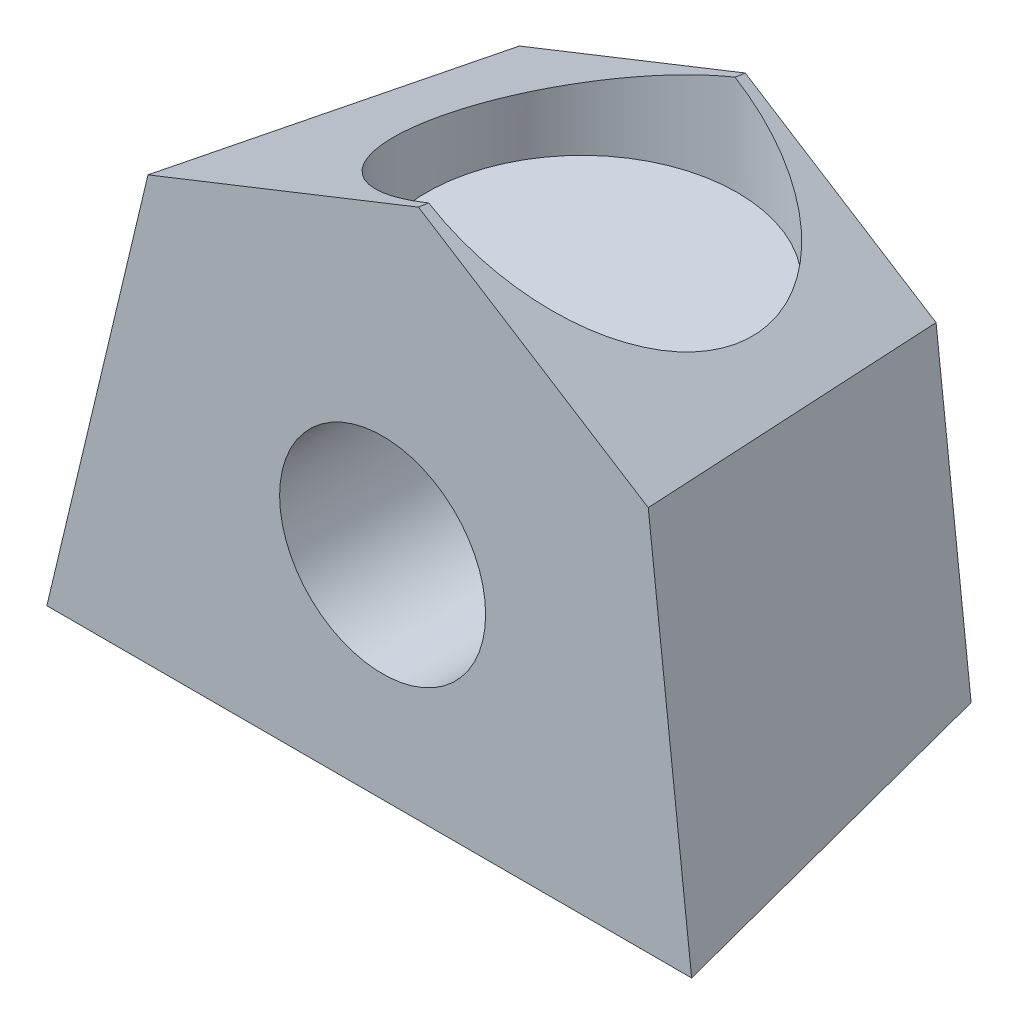
ISO-10303-21;
HEADER;
FILE_DESCRIPTION(('STEP AP214'),'2;1');
FILE_NAME('part.step','',(''),(''),'','','');
FILE_SCHEMA(('AUTOMOTIVE_DESIGN { 1 0 10303 214 1 1 1 1 }'));
ENDSEC;
DATA;
#1=APPLICATION_CONTEXT('core data for automotive mechanical design processes');
#2=APPLICATION_PROTOCOL_DEFINITION('international standard','automotive_design',2000,#1);
#3=PRODUCT_CONTEXT('',#1,'mechanical');
#4=PRODUCT('Part','Part','',(#3));
#5=PRODUCT_RELATED_PRODUCT_CATEGORY('part','',(#4));
#6=PRODUCT_DEFINITION_FORMATION('','',#4);
#7=PRODUCT_DEFINITION_CONTEXT('part definition',#1,'design');
#8=PRODUCT_DEFINITION('design','',#6,#7);
#9=PRODUCT_DEFINITION_SHAPE('','',#8);
#10=(LENGTH_UNIT() NAMED_UNIT(*) SI_UNIT(.MILLI.,.METRE.));
#11=(NAMED_UNIT(*) PLANE_ANGLE_UNIT() SI_UNIT($,.RADIAN.));
#12=(NAMED_UNIT(*) SI_UNIT($,.STERADIAN.) SOLID_ANGLE_UNIT());
#13=UNCERTAINTY_MEASURE_WITH_UNIT(LENGTH_MEASURE(1.E-05),#10,'distance_accuracy_value','');
#14=(GEOMETRIC_REPRESENTATION_CONTEXT(3) GLOBAL_UNCERTAINTY_ASSIGNED_CONTEXT((#13)) GLOBAL_UNIT_ASSIGNED_CONTEXT((#10,
#11,#12)) REPRESENTATION_CONTEXT('',''));
#15=CARTESIAN_POINT('',(0.,0.,0.));
#16=DIRECTION('',(0.,0.,1.));
#17=DIRECTION('',(1.,0.,0.));
#18=AXIS2_PLACEMENT_3D('',#15,#16,#17);
#19=CARTESIAN_POINT('',(-95.4109497659506,52.1768736820285,-38.354794611101));
#20=DIRECTION('',(-0.963221362089337,0.229859643225864,-0.139173100960066));
#21=DIRECTION('',(-0.23211860553877,-0.972687489876752,0.));
#22=AXIS2_PLACEMENT_3D('',#19,#20,#21);
#23=PLANE('',#22);
#24=DIRECTION('',(-0.23211860553877,-0.972687489876752,0.));
#25=VECTOR('',#24,1.);
#26=CARTESIAN_POINT('',(-95.4109497659506,52.1768736820285,-38.354794611101));
#27=LINE('',#26,#25);
#28=CARTESIAN_POINT('',(-95.4109497659506,52.1768736820285,-38.354794611101));
#29=VERTEX_POINT('',#28);
#30=CARTESIAN_POINT('',(-119.084736173718,-47.027564598138,-38.354794611101));
#31=VERTEX_POINT('',#30);
#32=EDGE_CURVE('E106',#29,#31,#27,.T.);
#33=ORIENTED_EDGE('',*,*,#32,.T.);
#34=DIRECTION('',(0.173615497552628,0.137059550727526,-0.975229377410218));
#35=VECTOR('',#34,1.);
#36=CARTESIAN_POINT('',(-114.429454368289,-43.3524846556425,-64.5043471612745));
#37=LINE('',#36,#35);
#38=CARTESIAN_POINT('',(-136.175164488452,-60.5194847295676,57.645205388899));
#39=VERTEX_POINT('',#38);
#40=EDGE_CURVE('E52',#39,#31,#37,.T.);
#41=ORIENTED_EDGE('',*,*,#40,.F.);
#42=DIRECTION('',(0.23211860553877,0.972687489876752,0.));
#43=VECTOR('',#42,1.);
#44=CARTESIAN_POINT('',(-112.32622679063,39.418920861304,57.645205388899));
#45=LINE('',#44,#43);
#46=CARTESIAN_POINT('',(-106.905929370217,62.132548146845,57.645205388899));
#47=VERTEX_POINT('',#46);
#48=EDGE_CURVE('E125',#47,#39,#45,.F.);
#49=ORIENTED_EDGE('',*,*,#48,.F.);
#50=DIRECTION('',(0.118264799742057,-0.102427832620218,-0.987685160487235));
#51=VECTOR('',#50,1.);
#52=CARTESIAN_POINT('',(-95.4109497659506,52.1768736820285,-38.354794611101));
#53=LINE('',#52,#51);
#54=EDGE_CURVE('E118',#47,#29,#53,.T.);
#55=ORIENTED_EDGE('',*,*,#54,.T.);
#56=EDGE_LOOP('',(#33,#41,#49,#55));
#57=FACE_BOUND('',#56,.T.);
#58=ADVANCED_FACE('F43',(#57),#23,.T.);
#59=CARTESIAN_POINT('',(35.3585370579052,-47.027564598138,-38.354794611101));
#60=DIRECTION('',(0.,-0.99026806874157,-0.139173100960066));
#61=DIRECTION('',(0.,0.139173100960066,-0.99026806874157));
#62=AXIS2_PLACEMENT_3D('',#59,#60,#61);
#63=PLANE('',#62);
#64=DIRECTION('',(1.,0.,0.));
#65=VECTOR('',#64,1.);
#66=CARTESIAN_POINT('',(35.3585370579052,-47.027564598138,-38.354794611101));
#67=LINE('',#66,#65);
#68=CARTESIAN_POINT('',(35.3585370579052,-47.027564598138,-38.354794611101));
#69=VERTEX_POINT('',#68);
#70=EDGE_CURVE('E150',#31,#69,#67,.T.);
#71=ORIENTED_EDGE('',*,*,#70,.T.);
#72=DIRECTION('',(-0.15385408532826,0.13751604739765,-0.978477519995187));
#73=VECTOR('',#72,1.);
#74=CARTESIAN_POINT('',(33.2102737723378,-45.1074291973105,-52.0172679050266));
#75=LINE('',#74,#73);
#76=CARTESIAN_POINT('',(50.4534083142071,-60.5194847295676,57.645205388899));
#77=VERTEX_POINT('',#76);
#78=EDGE_CURVE('E116',#77,#69,#75,.T.);
#79=ORIENTED_EDGE('',*,*,#78,.F.);
#80=DIRECTION('',(-1.,0.,0.));
#81=VECTOR('',#80,1.);
#82=CARTESIAN_POINT('',(117.653127903952,-60.5194847295676,57.645205388899));
#83=LINE('',#82,#81);
#84=EDGE_CURVE('E128',#39,#77,#83,.F.);
#85=ORIENTED_EDGE('',*,*,#84,.F.);
#86=ORIENTED_EDGE('',*,*,#40,.T.);
#87=EDGE_LOOP('',(#71,#79,#85,#86));
#88=FACE_BOUND('',#87,.T.);
#89=ADVANCED_FACE('F45',(#88),#63,.T.);
#90=CARTESIAN_POINT('',(25.2126285974336,43.1582883838315,-38.354794611101));
#91=DIRECTION('',(0.984060391300595,0.110706794021317,-0.139173100960066));
#92=DIRECTION('',(-0.140033873672067,0.,-0.990146713484621));
#93=AXIS2_PLACEMENT_3D('',#90,#91,#92);
#94=PLANE('',#93);
#95=DIRECTION('',(-0.111794773067865,0.993731316158802,0.));
#96=VECTOR('',#95,1.);
#97=CARTESIAN_POINT('',(25.2126285974336,43.1582883838315,-38.354794611101));
#98=LINE('',#97,#96);
#99=CARTESIAN_POINT('',(25.2126285974336,43.1582883838315,-38.354794611101));
#100=VERTEX_POINT('',#99);
#101=EDGE_CURVE('E155',#69,#100,#98,.T.);
#102=ORIENTED_EDGE('',*,*,#101,.T.);
#103=DIRECTION('',(-0.130545143692113,-0.0817308343231176,-0.988067829746143));
#104=VECTOR('',#103,1.);
#105=CARTESIAN_POINT('',(24.6441158925427,42.8023577350162,-42.6577437566436));
#106=LINE('',#105,#104);
#107=CARTESIAN_POINT('',(37.8963061923845,51.0992007977446,57.645205388899));
#108=VERTEX_POINT('',#107);
#109=EDGE_CURVE('E111',#108,#100,#106,.T.);
#110=ORIENTED_EDGE('',*,*,#109,.F.);
#111=DIRECTION('',(0.111794773067865,-0.993731316158802,0.));
#112=VECTOR('',#111,1.);
#113=CARTESIAN_POINT('',(46.2877178097608,-23.4911246900452,57.645205388899));
#114=LINE('',#113,#112);
#115=EDGE_CURVE('E132',#77,#108,#114,.F.);
#116=ORIENTED_EDGE('',*,*,#115,.F.);
#117=ORIENTED_EDGE('',*,*,#78,.T.);
#118=EDGE_LOOP('',(#102,#110,#116,#117));
#119=FACE_BOUND('',#118,.T.);
#120=ADVANCED_FACE('F187',(#119),#94,.T.);
#121=CARTESIAN_POINT('',(-30.0262063540227,78.1053064143447,-38.354794611101));
#122=DIRECTION('',(0.529438616209507,0.836854586911802,-0.139173100960066));
#123=DIRECTION('',(-0.845078836052216,0.534641712604462,0.));
#124=AXIS2_PLACEMENT_3D('',#121,#122,#123);
#125=PLANE('',#124);
#126=DIRECTION('',(-0.0145089346684932,-0.155095773187638,-0.987792889200015));
#127=VECTOR('',#126,1.);
#128=CARTESIAN_POINT('',(-30.0983165325446,77.3344721561386,-43.264177912518));
#129=LINE('',#128,#127);
#130=CARTESIAN_POINT('',(-29.9820703584861,78.5771057924217,-35.3499411504613));
#131=VERTEX_POINT('',#130);
#132=CARTESIAN_POINT('',(-30.0262063540227,78.1053064143447,-38.354794611101));
#133=VERTEX_POINT('',#132);
#134=EDGE_CURVE('E104',#131,#133,#129,.T.);
#135=ORIENTED_EDGE('',*,*,#134,.F.);
#136=CARTESIAN_POINT('',(-29.3211710458097,85.641903604304,9.64520538889899));
#137=DIRECTION('',(0.529438616209507,0.836854586911802,-0.139173100960066));
#138=DIRECTION('',(-0.809358240965467,0.5474252463713,0.212755346387832));
#139=AXIS2_PLACEMENT_3D('',#136,#137,#138);
#140=ELLIPSE('',#139,53.7727828750524,45.);
#141=CARTESIAN_POINT('',(-28.6602717331334,92.7067014161863,54.6403519282592));
#142=VERTEX_POINT('',#141);
#143=EDGE_CURVE('E58',#131,#142,#140,.F.);
#144=ORIENTED_EDGE('',*,*,#143,.T.);
#145=CARTESIAN_POINT('',(-28.6161357375968,93.1785007942633,57.645205388899));
#146=VERTEX_POINT('',#145);
#147=EDGE_CURVE('E102',#146,#142,#129,.T.);
#148=ORIENTED_EDGE('',*,*,#147,.F.);
#149=DIRECTION('',(0.845078836052216,-0.534641712604462,0.));
#150=VECTOR('',#149,1.);
#151=CARTESIAN_POINT('',(124.928839454715,-3.9621977967911,57.645205388899));
#152=LINE('',#151,#150);
#153=EDGE_CURVE('E135',#108,#146,#152,.F.);
#154=ORIENTED_EDGE('',*,*,#153,.F.);
#155=ORIENTED_EDGE('',*,*,#109,.T.);
#156=DIRECTION('',(-0.845078836052216,0.534641712604462,0.));
#157=VECTOR('',#156,1.);
#158=CARTESIAN_POINT('',(-30.0262063540227,78.1053064143447,-38.354794611101));
#159=LINE('',#158,#157);
#160=EDGE_CURVE('E161',#100,#133,#159,.T.);
#161=ORIENTED_EDGE('',*,*,#160,.T.);
#162=EDGE_LOOP('',(#135,#144,#148,#154,#155,#161));
#163=FACE_BOUND('',#162,.T.);
#164=ADVANCED_FACE('F100',(#163),#125,.T.);
#165=CARTESIAN_POINT('',(-95.4109497659506,52.1768736820285,-38.354794611101));
#166=DIRECTION('',(-0.365038280113238,0.920531315068167,-0.139173100960066));
#167=DIRECTION('',(-0.929577903322658,-0.368625720283123,0.));
#168=AXIS2_PLACEMENT_3D('',#165,#166,#167);
#169=PLANE('',#168);
#170=ORIENTED_EDGE('',*,*,#147,.T.);
#171=CARTESIAN_POINT('',(-29.3211710458097,85.641903604304,9.64520538889899));
#172=DIRECTION('',(-0.365038280113238,0.920531315068167,-0.139173100960066));
#173=DIRECTION('',(0.860138262129587,0.390668782959263,0.327933029812221));
#174=AXIS2_PLACEMENT_3D('',#171,#172,#173);
#175=ELLIPSE('',#174,48.8848116988477,45.);
#176=EDGE_CURVE('E11',#142,#131,#175,.F.);
#177=ORIENTED_EDGE('',*,*,#176,.T.);
#178=ORIENTED_EDGE('',*,*,#134,.T.);
#179=DIRECTION('',(-0.929577903322658,-0.368625720283123,0.));
#180=VECTOR('',#179,1.);
#181=CARTESIAN_POINT('',(-95.4109497659506,52.1768736820285,-38.354794611101));
#182=LINE('',#181,#180);
#183=EDGE_CURVE('E129',#133,#29,#182,.T.);
#184=ORIENTED_EDGE('',*,*,#183,.T.);
#185=ORIENTED_EDGE('',*,*,#54,.F.);
#186=DIRECTION('',(0.929577903322658,0.368625720283123,0.));
#187=VECTOR('',#186,1.);
#188=CARTESIAN_POINT('',(60.5497225757835,128.537375642673,57.645205388899));
#189=LINE('',#188,#187);
#190=EDGE_CURVE('E65',#146,#47,#189,.F.);
#191=ORIENTED_EDGE('',*,*,#190,.F.);
#192=EDGE_LOOP('',(#170,#177,#178,#184,#185,#191));
#193=FACE_BOUND('',#192,.T.);
#194=ADVANCED_FACE('F109',(#193),#169,.T.);
#195=CARTESIAN_POINT('',(117.653127903952,-15.4625160544486,57.645205388899));
#196=DIRECTION('',(0.,0.,-1.));
#197=DIRECTION('',(-1.,0.,0.));
#198=AXIS2_PLACEMENT_3D('',#195,#196,#197);
#199=PLANE('',#198);
#200=CARTESIAN_POINT('',(-38.9931577322128,0.80653170863872,57.645205388899));
#201=DIRECTION('',(0.,0.,1.));
#202=DIRECTION('',(1.,0.,0.));
#203=AXIS2_PLACEMENT_3D('',#200,#201,#202);
#204=CIRCLE('',#203,29.815);
#205=CARTESIAN_POINT('',(-9.17815773221278,0.80653170863872,57.645205388899));
#206=VERTEX_POINT('',#205);
#207=EDGE_CURVE('E281',#206,#206,#204,.T.);
#208=ORIENTED_EDGE('',*,*,#207,.F.);
#209=EDGE_LOOP('',(#208));
#210=FACE_BOUND('',#209,.T.);
#211=ORIENTED_EDGE('',*,*,#48,.T.);
#212=ORIENTED_EDGE('',*,*,#84,.T.);
#213=ORIENTED_EDGE('',*,*,#115,.T.);
#214=ORIENTED_EDGE('',*,*,#153,.T.);
#215=ORIENTED_EDGE('',*,*,#190,.T.);
#216=EDGE_LOOP('',(#211,#212,#213,#214,#215));
#217=FACE_BOUND('',#216,.T.);
#218=ADVANCED_FACE('F169',(#210,#217),#199,.F.);
#219=CARTESIAN_POINT('',(117.653127903952,-15.4625160544486,-38.354794611101));
#220=DIRECTION('',(0.,0.,-1.));
#221=DIRECTION('',(-1.,0.,0.));
#222=AXIS2_PLACEMENT_3D('',#219,#220,#221);
#223=PLANE('',#222);
#224=CARTESIAN_POINT('',(-38.9931577322128,0.80653170863872,-38.354794611101));
#225=DIRECTION('',(0.,0.,-1.));
#226=DIRECTION('',(-1.,0.,0.));
#227=AXIS2_PLACEMENT_3D('',#224,#225,#226);
#228=CIRCLE('',#227,29.815);
#229=CARTESIAN_POINT('',(-9.17815773221278,0.80653170863872,-38.354794611101));
#230=VERTEX_POINT('',#229);
#231=EDGE_CURVE('E284',#230,#230,#228,.F.);
#232=ORIENTED_EDGE('',*,*,#231,.T.);
#233=EDGE_LOOP('',(#232));
#234=FACE_BOUND('',#233,.T.);
#235=ORIENTED_EDGE('',*,*,#32,.F.);
#236=ORIENTED_EDGE('',*,*,#183,.F.);
#237=ORIENTED_EDGE('',*,*,#160,.F.);
#238=ORIENTED_EDGE('',*,*,#101,.F.);
#239=ORIENTED_EDGE('',*,*,#70,.F.);
#240=EDGE_LOOP('',(#235,#236,#237,#238,#239));
#241=FACE_BOUND('',#240,.T.);
#242=ADVANCED_FACE('F147',(#234,#241),#223,.T.);
#243=CARTESIAN_POINT('',(-29.3211710458097,50.,9.64520538889899));
#244=DIRECTION('',(0.,1.,0.));
#245=DIRECTION('',(0.,0.,1.));
#246=AXIS2_PLACEMENT_3D('',#243,#244,#245);
#247=CYLINDRICAL_SURFACE('',#246,45.);
#248=CARTESIAN_POINT('',(-29.3211710458097,50.,9.64520538889899));
#249=DIRECTION('',(0.,1.,0.));
#250=DIRECTION('',(0.,0.,1.));
#251=AXIS2_PLACEMENT_3D('',#248,#249,#250);
#252=CIRCLE('',#251,45.);
#253=CARTESIAN_POINT('',(-29.3211710458097,50.,54.645205388899));
#254=VERTEX_POINT('',#253);
#255=EDGE_CURVE('E107',#254,#254,#252,.T.);
#256=ORIENTED_EDGE('',*,*,#255,.F.);
#257=EDGE_LOOP('',(#256));
#258=FACE_BOUND('',#257,.T.);
#259=ORIENTED_EDGE('',*,*,#176,.F.);
#260=ORIENTED_EDGE('',*,*,#143,.F.);
#261=EDGE_LOOP('',(#259,#260));
#262=FACE_BOUND('',#261,.T.);
#263=ADVANCED_FACE('F94',(#258,#262),#247,.F.);
#264=CARTESIAN_POINT('',(-29.3211710458097,50.,9.64520538889899));
#265=DIRECTION('',(0.,1.,0.));
#266=DIRECTION('',(0.,0.,1.));
#267=AXIS2_PLACEMENT_3D('',#264,#265,#266);
#268=PLANE('',#267);
#269=ORIENTED_EDGE('',*,*,#255,.T.);
#270=EDGE_LOOP('',(#269));
#271=FACE_BOUND('',#270,.T.);
#272=ADVANCED_FACE('F216',(#271),#268,.T.);
#273=CARTESIAN_POINT('',(-38.9931577322128,0.80653170863872,-122.684349335409));
#274=DIRECTION('',(0.,0.,1.));
#275=DIRECTION('',(1.,0.,0.));
#276=AXIS2_PLACEMENT_3D('',#273,#274,#275);
#277=CYLINDRICAL_SURFACE('',#276,29.815);
#278=CARTESIAN_POINT('',(-9.17815773221278,0.80653170863872,57.645205388899));
#279=CARTESIAN_POINT('',(-9.17815773221278,0.80653170863872,56.645205388899));
#280=CARTESIAN_POINT('',(-9.17815773221278,0.80653170863872,55.645205388899));
#281=CARTESIAN_POINT('',(-9.17815773221278,0.80653170863872,53.645205388899));
#282=CARTESIAN_POINT('',(-9.17815773221278,0.80653170863872,52.645205388899));
#283=CARTESIAN_POINT('',(-9.17815773221278,0.80653170863872,50.645205388899));
#284=CARTESIAN_POINT('',(-9.17815773221278,0.80653170863872,49.645205388899));
#285=CARTESIAN_POINT('',(-9.17815773221278,0.80653170863872,47.645205388899));
#286=CARTESIAN_POINT('',(-9.17815773221278,0.80653170863872,46.645205388899));
#287=CARTESIAN_POINT('',(-9.17815773221278,0.80653170863872,44.645205388899));
#288=CARTESIAN_POINT('',(-9.17815773221278,0.80653170863872,43.645205388899));
#289=CARTESIAN_POINT('',(-9.17815773221278,0.80653170863872,41.645205388899));
#290=CARTESIAN_POINT('',(-9.17815773221278,0.80653170863872,40.645205388899));
#291=CARTESIAN_POINT('',(-9.17815773221278,0.80653170863872,38.645205388899));
#292=CARTESIAN_POINT('',(-9.17815773221278,0.80653170863872,37.645205388899));
#293=CARTESIAN_POINT('',(-9.17815773221278,0.80653170863872,35.645205388899));
#294=CARTESIAN_POINT('',(-9.17815773221278,0.80653170863872,34.645205388899));
#295=CARTESIAN_POINT('',(-9.17815773221278,0.80653170863872,32.645205388899));
#296=CARTESIAN_POINT('',(-9.17815773221278,0.80653170863872,31.645205388899));
#297=CARTESIAN_POINT('',(-9.17815773221278,0.80653170863872,29.645205388899));
#298=CARTESIAN_POINT('',(-9.17815773221278,0.80653170863872,28.645205388899));
#299=CARTESIAN_POINT('',(-9.17815773221278,0.80653170863872,26.645205388899));
#300=CARTESIAN_POINT('',(-9.17815773221278,0.80653170863872,25.645205388899));
#301=CARTESIAN_POINT('',(-9.17815773221278,0.80653170863872,23.645205388899));
#302=CARTESIAN_POINT('',(-9.17815773221278,0.80653170863872,22.645205388899));
#303=CARTESIAN_POINT('',(-9.17815773221278,0.80653170863872,20.645205388899));
#304=CARTESIAN_POINT('',(-9.17815773221278,0.80653170863872,19.645205388899));
#305=CARTESIAN_POINT('',(-9.17815773221278,0.80653170863872,17.645205388899));
#306=CARTESIAN_POINT('',(-9.17815773221278,0.80653170863872,16.645205388899));
#307=CARTESIAN_POINT('',(-9.17815773221278,0.80653170863872,14.645205388899));
#308=CARTESIAN_POINT('',(-9.17815773221278,0.80653170863872,13.645205388899));
#309=CARTESIAN_POINT('',(-9.17815773221278,0.80653170863872,11.645205388899));
#310=CARTESIAN_POINT('',(-9.17815773221278,0.80653170863872,10.645205388899));
#311=CARTESIAN_POINT('',(-9.17815773221278,0.80653170863872,8.64520538889897));
#312=CARTESIAN_POINT('',(-9.17815773221278,0.80653170863872,7.64520538889897));
#313=CARTESIAN_POINT('',(-9.17815773221278,0.80653170863872,5.64520538889897));
#314=CARTESIAN_POINT('',(-9.17815773221278,0.80653170863872,4.64520538889897));
#315=CARTESIAN_POINT('',(-9.17815773221278,0.80653170863872,2.64520538889898));
#316=CARTESIAN_POINT('',(-9.17815773221278,0.80653170863872,1.64520538889898));
#317=CARTESIAN_POINT('',(-9.17815773221278,0.80653170863872,-0.354794611101008));
#318=CARTESIAN_POINT('',(-9.17815773221278,0.80653170863872,-1.35479461110101));
#319=CARTESIAN_POINT('',(-9.17815773221278,0.80653170863872,-3.35479461110101));
#320=CARTESIAN_POINT('',(-9.17815773221278,0.80653170863872,-4.35479461110101));
#321=CARTESIAN_POINT('',(-9.17815773221278,0.80653170863872,-6.35479461110101));
#322=CARTESIAN_POINT('',(-9.17815773221278,0.80653170863872,-7.35479461110102));
#323=CARTESIAN_POINT('',(-9.17815773221278,0.80653170863872,-9.35479461110102));
#324=CARTESIAN_POINT('',(-9.17815773221278,0.80653170863872,-10.354794611101));
#325=CARTESIAN_POINT('',(-9.17815773221278,0.80653170863872,-12.354794611101));
#326=CARTESIAN_POINT('',(-9.17815773221278,0.80653170863872,-13.354794611101));
#327=CARTESIAN_POINT('',(-9.17815773221278,0.80653170863872,-15.354794611101));
#328=CARTESIAN_POINT('',(-9.17815773221278,0.80653170863872,-16.354794611101));
#329=CARTESIAN_POINT('',(-9.17815773221278,0.80653170863872,-18.354794611101));
#330=CARTESIAN_POINT('',(-9.17815773221278,0.80653170863872,-19.354794611101));
#331=CARTESIAN_POINT('',(-9.17815773221278,0.80653170863872,-21.354794611101));
#332=CARTESIAN_POINT('',(-9.17815773221278,0.80653170863872,-22.354794611101));
#333=CARTESIAN_POINT('',(-9.17815773221278,0.80653170863872,-24.354794611101));
#334=CARTESIAN_POINT('',(-9.17815773221278,0.80653170863872,-25.354794611101));
#335=CARTESIAN_POINT('',(-9.17815773221278,0.80653170863872,-27.354794611101));
#336=CARTESIAN_POINT('',(-9.17815773221278,0.80653170863872,-28.354794611101));
#337=CARTESIAN_POINT('',(-9.17815773221278,0.80653170863872,-30.354794611101));
#338=CARTESIAN_POINT('',(-9.17815773221278,0.80653170863872,-31.354794611101));
#339=CARTESIAN_POINT('',(-9.17815773221278,0.80653170863872,-33.354794611101));
#340=CARTESIAN_POINT('',(-9.17815773221278,0.80653170863872,-34.354794611101));
#341=CARTESIAN_POINT('',(-9.17815773221278,0.80653170863872,-36.354794611101));
#342=CARTESIAN_POINT('',(-9.17815773221278,0.80653170863872,-37.354794611101));
#343=CARTESIAN_POINT('',(-9.17815773221278,0.80653170863872,-38.354794611101));
#344=B_SPLINE_CURVE_WITH_KNOTS('',3,(#278,#279,#280,#281,#282,#283,#284,#285,#286,#287,#288,
#289,#290,#291,#292,#293,#294,#295,#296,#297,#298,#299,#300,#301,#302,#303,#304,#305,#306,#307,
#308,#309,#310,#311,#312,#313,#314,#315,#316,#317,#318,#319,#320,#321,#322,#323,#324,#325,#326,
#327,#328,#329,#330,#331,#332,#333,#334,#335,#336,#337,#338,#339,#340,#341,#342,#343),
.UNSPECIFIED.,.F.,.F.,(4,2,2,2,2,2,2,2,2,2,2,2,2,2,2,2,2,2,2,2,2,2,2,2,2,2,2,2,2,2,2,2,4),(0.,
3.,6.00000000000001,9.00000000000001,12.,15.,18.,21.,24.,27.,30.,33.,36.,39.,42.,45.,48.,51.,
54.,57.,60.,63.,66.,69.,72.,75.,78.,81.,84.,87.,90.,93.,96.),.UNSPECIFIED.);
#345=EDGE_CURVE('BSEAM226',#206,#230,#344,.T.);
#346=ORIENTED_EDGE('',*,*,#207,.T.);
#347=ORIENTED_EDGE('',*,*,#231,.F.);
#348=ORIENTED_EDGE('',*,*,#345,.T.);
#349=ORIENTED_EDGE('',*,*,#345,.F.);
#350=EDGE_LOOP('',(#346,#348,#347,#349));
#351=FACE_BOUND('',#350,.T.);
#352=ADVANCED_FACE('F226',(#351),#277,.F.);
#353=CLOSED_SHELL('',(#58,#89,#120,#164,#194,#218,#242,#263,#272,#352));
#354=MANIFOLD_SOLID_BREP('B2',#353);
#355=ADVANCED_BREP_SHAPE_REPRESENTATION('',(#18,#354),#14);
#356=SHAPE_DEFINITION_REPRESENTATION(#9,#355);
ENDSEC;
END-ISO-10303-21;
